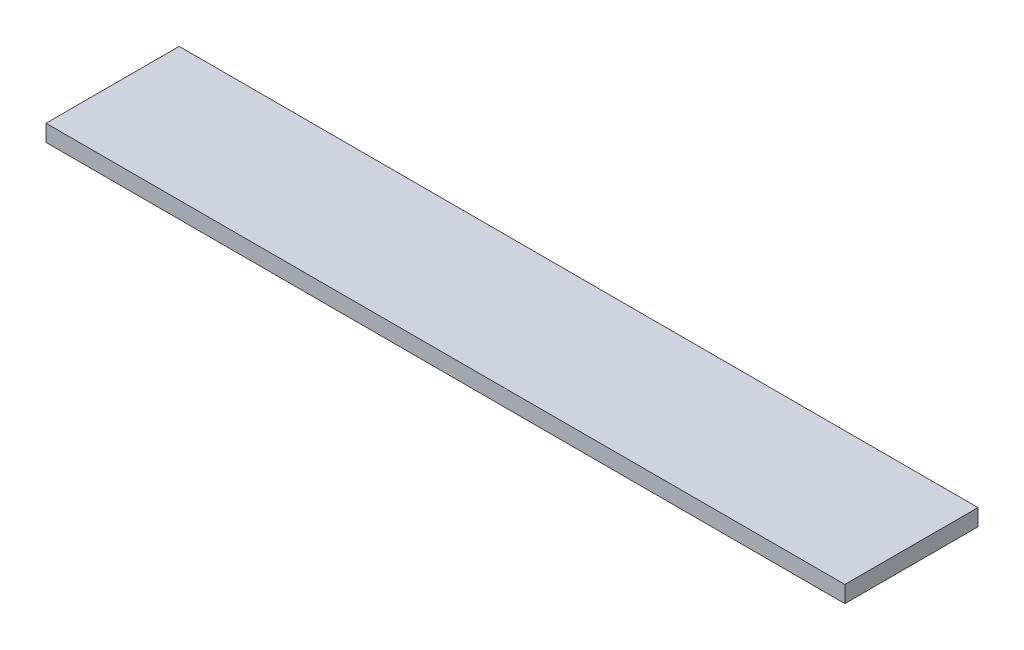
ISO-10303-21;
HEADER;
FILE_DESCRIPTION(('STEP AP214'),'2;1');
FILE_NAME('part.step','',(''),(''),'','','');
FILE_SCHEMA(('AUTOMOTIVE_DESIGN { 1 0 10303 214 1 1 1 1 }'));
ENDSEC;
DATA;
#1=APPLICATION_CONTEXT('core data for automotive mechanical design processes');
#2=APPLICATION_PROTOCOL_DEFINITION('international standard','automotive_design',2000,#1);
#3=PRODUCT_CONTEXT('',#1,'mechanical');
#4=PRODUCT('Part','Part','',(#3));
#5=PRODUCT_RELATED_PRODUCT_CATEGORY('part','',(#4));
#6=PRODUCT_DEFINITION_FORMATION('','',#4);
#7=PRODUCT_DEFINITION_CONTEXT('part definition',#1,'design');
#8=PRODUCT_DEFINITION('design','',#6,#7);
#9=PRODUCT_DEFINITION_SHAPE('','',#8);
#10=(LENGTH_UNIT() NAMED_UNIT(*) SI_UNIT(.MILLI.,.METRE.));
#11=(NAMED_UNIT(*) PLANE_ANGLE_UNIT() SI_UNIT($,.RADIAN.));
#12=(NAMED_UNIT(*) SI_UNIT($,.STERADIAN.) SOLID_ANGLE_UNIT());
#13=UNCERTAINTY_MEASURE_WITH_UNIT(LENGTH_MEASURE(1.E-05),#10,'distance_accuracy_value','');
#14=(GEOMETRIC_REPRESENTATION_CONTEXT(3) GLOBAL_UNCERTAINTY_ASSIGNED_CONTEXT((#13)) GLOBAL_UNIT_ASSIGNED_CONTEXT((#10,
#11,#12)) REPRESENTATION_CONTEXT('',''));
#15=CARTESIAN_POINT('',(0.,0.,0.));
#16=DIRECTION('',(0.,0.,1.));
#17=DIRECTION('',(1.,0.,0.));
#18=AXIS2_PLACEMENT_3D('',#15,#16,#17);
#19=CARTESIAN_POINT('',(76.2,3.175,12.7));
#20=DIRECTION('',(-1.,0.,0.));
#21=DIRECTION('',(0.,0.,1.));
#22=AXIS2_PLACEMENT_3D('',#19,#20,#21);
#23=PLANE('',#22);
#24=DIRECTION('',(0.,0.,-1.));
#25=VECTOR('',#24,1.);
#26=CARTESIAN_POINT('',(76.2,0.,12.7));
#27=LINE('',#26,#25);
#28=CARTESIAN_POINT('',(76.2,0.,12.7));
#29=VERTEX_POINT('',#28);
#30=CARTESIAN_POINT('',(76.2,0.,-12.7));
#31=VERTEX_POINT('',#30);
#32=EDGE_CURVE('E116',#29,#31,#27,.T.);
#33=ORIENTED_EDGE('',*,*,#32,.T.);
#34=DIRECTION('',(0.,-1.,0.));
#35=VECTOR('',#34,1.);
#36=CARTESIAN_POINT('',(76.2,3.175,-12.7));
#37=LINE('',#36,#35);
#38=CARTESIAN_POINT('',(76.2,3.175,-12.7));
#39=VERTEX_POINT('',#38);
#40=EDGE_CURVE('E11',#39,#31,#37,.T.);
#41=ORIENTED_EDGE('',*,*,#40,.F.);
#42=DIRECTION('',(0.,0.,-1.));
#43=VECTOR('',#42,1.);
#44=CARTESIAN_POINT('',(76.2,3.175,12.7));
#45=LINE('',#44,#43);
#46=CARTESIAN_POINT('',(76.2,3.175,12.7));
#47=VERTEX_POINT('',#46);
#48=EDGE_CURVE('E97',#47,#39,#45,.T.);
#49=ORIENTED_EDGE('',*,*,#48,.F.);
#50=DIRECTION('',(0.,-1.,0.));
#51=VECTOR('',#50,1.);
#52=CARTESIAN_POINT('',(76.2,3.175,12.7));
#53=LINE('',#52,#51);
#54=EDGE_CURVE('E112',#47,#29,#53,.T.);
#55=ORIENTED_EDGE('',*,*,#54,.T.);
#56=EDGE_LOOP('',(#33,#41,#49,#55));
#57=FACE_BOUND('',#56,.T.);
#58=ADVANCED_FACE('F44',(#57),#23,.F.);
#59=CARTESIAN_POINT('',(-76.2,3.175,-12.7));
#60=DIRECTION('',(0.,0.,1.));
#61=DIRECTION('',(1.,0.,0.));
#62=AXIS2_PLACEMENT_3D('',#59,#60,#61);
#63=PLANE('',#62);
#64=DIRECTION('',(-1.,0.,0.));
#65=VECTOR('',#64,1.);
#66=CARTESIAN_POINT('',(-76.2,0.,-12.7));
#67=LINE('',#66,#65);
#68=CARTESIAN_POINT('',(-76.2,0.,-12.7));
#69=VERTEX_POINT('',#68);
#70=EDGE_CURVE('E102',#31,#69,#67,.T.);
#71=ORIENTED_EDGE('',*,*,#70,.T.);
#72=DIRECTION('',(0.,-1.,0.));
#73=VECTOR('',#72,1.);
#74=CARTESIAN_POINT('',(-76.2,3.175,-12.7));
#75=LINE('',#74,#73);
#76=CARTESIAN_POINT('',(-76.2,3.175,-12.7));
#77=VERTEX_POINT('',#76);
#78=EDGE_CURVE('E53',#77,#69,#75,.T.);
#79=ORIENTED_EDGE('',*,*,#78,.F.);
#80=DIRECTION('',(-1.,0.,0.));
#81=VECTOR('',#80,1.);
#82=CARTESIAN_POINT('',(-76.2,3.175,-12.7));
#83=LINE('',#82,#81);
#84=EDGE_CURVE('E92',#39,#77,#83,.T.);
#85=ORIENTED_EDGE('',*,*,#84,.F.);
#86=ORIENTED_EDGE('',*,*,#40,.T.);
#87=EDGE_LOOP('',(#71,#79,#85,#86));
#88=FACE_BOUND('',#87,.T.);
#89=ADVANCED_FACE('F101',(#88),#63,.F.);
#90=CARTESIAN_POINT('',(-76.2,3.175,12.7));
#91=DIRECTION('',(1.,0.,0.));
#92=DIRECTION('',(0.,0.,-1.));
#93=AXIS2_PLACEMENT_3D('',#90,#91,#92);
#94=PLANE('',#93);
#95=DIRECTION('',(0.,0.,1.));
#96=VECTOR('',#95,1.);
#97=CARTESIAN_POINT('',(-76.2,0.,12.7));
#98=LINE('',#97,#96);
#99=CARTESIAN_POINT('',(-76.2,0.,12.7));
#100=VERTEX_POINT('',#99);
#101=EDGE_CURVE('E79',#69,#100,#98,.T.);
#102=ORIENTED_EDGE('',*,*,#101,.T.);
#103=DIRECTION('',(0.,-1.,0.));
#104=VECTOR('',#103,1.);
#105=CARTESIAN_POINT('',(-76.2,3.175,12.7));
#106=LINE('',#105,#104);
#107=CARTESIAN_POINT('',(-76.2,3.175,12.7));
#108=VERTEX_POINT('',#107);
#109=EDGE_CURVE('E104',#108,#100,#106,.T.);
#110=ORIENTED_EDGE('',*,*,#109,.F.);
#111=DIRECTION('',(0.,0.,1.));
#112=VECTOR('',#111,1.);
#113=CARTESIAN_POINT('',(-76.2,3.175,12.7));
#114=LINE('',#113,#112);
#115=EDGE_CURVE('E95',#77,#108,#114,.T.);
#116=ORIENTED_EDGE('',*,*,#115,.F.);
#117=ORIENTED_EDGE('',*,*,#78,.T.);
#118=EDGE_LOOP('',(#102,#110,#116,#117));
#119=FACE_BOUND('',#118,.T.);
#120=ADVANCED_FACE('F105',(#119),#94,.F.);
#121=CARTESIAN_POINT('',(-76.2,3.175,12.7));
#122=DIRECTION('',(0.,0.,-1.));
#123=DIRECTION('',(-1.,0.,0.));
#124=AXIS2_PLACEMENT_3D('',#121,#122,#123);
#125=PLANE('',#124);
#126=DIRECTION('',(1.,0.,0.));
#127=VECTOR('',#126,1.);
#128=CARTESIAN_POINT('',(-76.2,0.,12.7));
#129=LINE('',#128,#127);
#130=EDGE_CURVE('E85',#100,#29,#129,.T.);
#131=ORIENTED_EDGE('',*,*,#130,.T.);
#132=ORIENTED_EDGE('',*,*,#54,.F.);
#133=DIRECTION('',(1.,0.,0.));
#134=VECTOR('',#133,1.);
#135=CARTESIAN_POINT('',(-76.2,3.175,12.7));
#136=LINE('',#135,#134);
#137=EDGE_CURVE('E61',#108,#47,#136,.T.);
#138=ORIENTED_EDGE('',*,*,#137,.F.);
#139=ORIENTED_EDGE('',*,*,#109,.T.);
#140=EDGE_LOOP('',(#131,#132,#138,#139));
#141=FACE_BOUND('',#140,.T.);
#142=ADVANCED_FACE('F129',(#141),#125,.F.);
#143=CARTESIAN_POINT('',(0.,3.175,0.));
#144=DIRECTION('',(0.,-1.,0.));
#145=DIRECTION('',(0.,0.,-1.));
#146=AXIS2_PLACEMENT_3D('',#143,#144,#145);
#147=PLANE('',#146);
#148=ORIENTED_EDGE('',*,*,#48,.T.);
#149=ORIENTED_EDGE('',*,*,#84,.T.);
#150=ORIENTED_EDGE('',*,*,#115,.T.);
#151=ORIENTED_EDGE('',*,*,#137,.T.);
#152=EDGE_LOOP('',(#148,#149,#150,#151));
#153=FACE_BOUND('',#152,.T.);
#154=ADVANCED_FACE('F93',(#153),#147,.F.);
#155=CARTESIAN_POINT('',(0.,0.,0.));
#156=DIRECTION('',(0.,-1.,0.));
#157=DIRECTION('',(0.,0.,-1.));
#158=AXIS2_PLACEMENT_3D('',#155,#156,#157);
#159=PLANE('',#158);
#160=ORIENTED_EDGE('',*,*,#32,.F.);
#161=ORIENTED_EDGE('',*,*,#130,.F.);
#162=ORIENTED_EDGE('',*,*,#101,.F.);
#163=ORIENTED_EDGE('',*,*,#70,.F.);
#164=EDGE_LOOP('',(#160,#161,#162,#163));
#165=FACE_BOUND('',#164,.T.);
#166=ADVANCED_FACE('F132',(#165),#159,.T.);
#167=CLOSED_SHELL('',(#58,#89,#120,#142,#154,#166));
#168=MANIFOLD_SOLID_BREP('B2',#167);
#169=ADVANCED_BREP_SHAPE_REPRESENTATION('',(#18,#168),#14);
#170=SHAPE_DEFINITION_REPRESENTATION(#9,#169);
ENDSEC;
END-ISO-10303-21;
